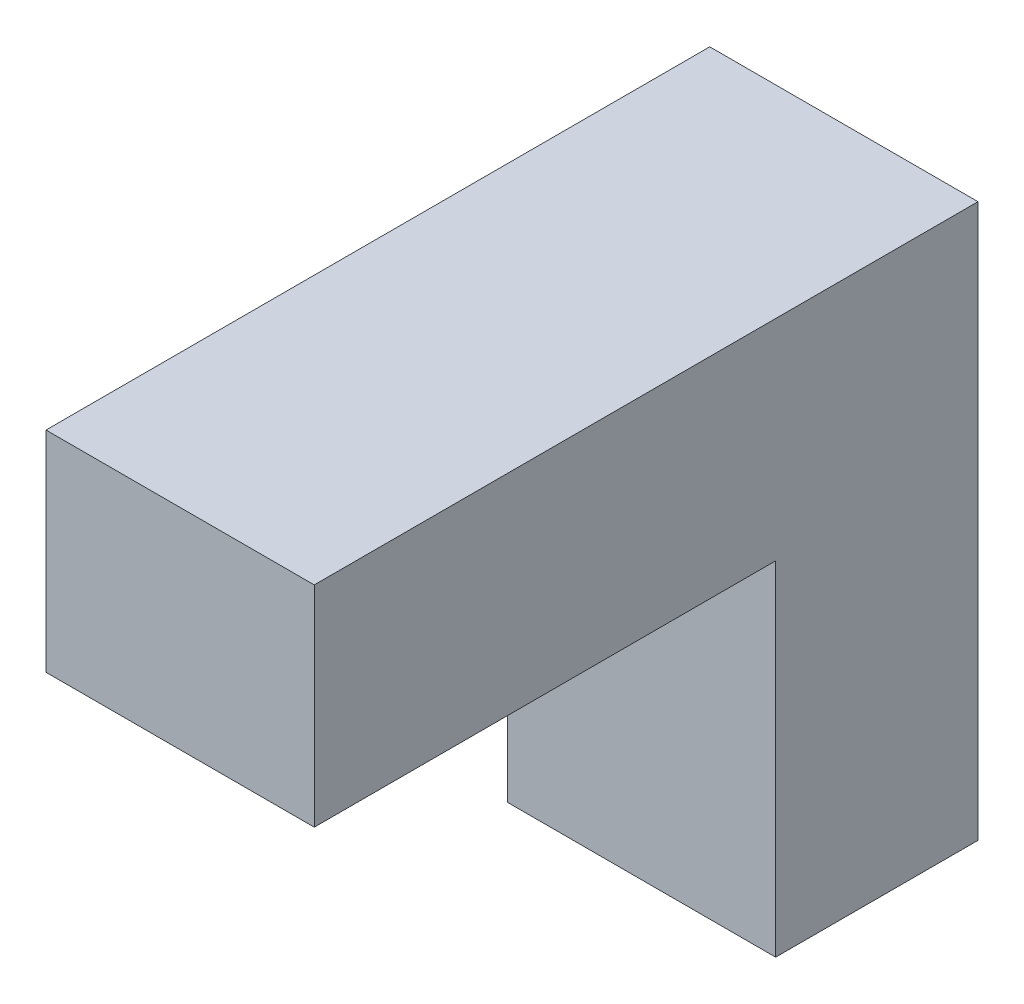
ISO-10303-21;
HEADER;
FILE_DESCRIPTION(('STEP AP214'),'2;1');
FILE_NAME('part.step','',(''),(''),'','','');
FILE_SCHEMA(('AUTOMOTIVE_DESIGN { 1 0 10303 214 1 1 1 1 }'));
ENDSEC;
DATA;
#1=APPLICATION_CONTEXT('core data for automotive mechanical design processes');
#2=APPLICATION_PROTOCOL_DEFINITION('international standard','automotive_design',2000,#1);
#3=PRODUCT_CONTEXT('',#1,'mechanical');
#4=PRODUCT('Part','Part','',(#3));
#5=PRODUCT_RELATED_PRODUCT_CATEGORY('part','',(#4));
#6=PRODUCT_DEFINITION_FORMATION('','',#4);
#7=PRODUCT_DEFINITION_CONTEXT('part definition',#1,'design');
#8=PRODUCT_DEFINITION('design','',#6,#7);
#9=PRODUCT_DEFINITION_SHAPE('','',#8);
#10=(LENGTH_UNIT() NAMED_UNIT(*) SI_UNIT(.MILLI.,.METRE.));
#11=(NAMED_UNIT(*) PLANE_ANGLE_UNIT() SI_UNIT($,.RADIAN.));
#12=(NAMED_UNIT(*) SI_UNIT($,.STERADIAN.) SOLID_ANGLE_UNIT());
#13=UNCERTAINTY_MEASURE_WITH_UNIT(LENGTH_MEASURE(1.E-05),#10,'distance_accuracy_value','');
#14=(GEOMETRIC_REPRESENTATION_CONTEXT(3) GLOBAL_UNCERTAINTY_ASSIGNED_CONTEXT((#13)) GLOBAL_UNIT_ASSIGNED_CONTEXT((#10,
#11,#12)) REPRESENTATION_CONTEXT('',''));
#15=CARTESIAN_POINT('',(0.,0.,0.));
#16=DIRECTION('',(0.,0.,1.));
#17=DIRECTION('',(1.,0.,0.));
#18=AXIS2_PLACEMENT_3D('',#15,#16,#17);
#19=CARTESIAN_POINT('',(9.7,0.,7.31641940323385));
#20=DIRECTION('',(0.,1.,0.));
#21=DIRECTION('',(0.,0.,1.));
#22=AXIS2_PLACEMENT_3D('',#19,#20,#21);
#23=PLANE('',#22);
#24=DIRECTION('',(0.,0.,-1.));
#25=VECTOR('',#24,1.);
#26=CARTESIAN_POINT('',(1.,0.,6.31641940323385));
#27=LINE('',#26,#25);
#28=CARTESIAN_POINT('',(0.999999999999999,0.,6.31641940323385));
#29=VERTEX_POINT('',#28);
#30=CARTESIAN_POINT('',(1.,0.,1.));
#31=VERTEX_POINT('',#30);
#32=EDGE_CURVE('E211',#29,#31,#27,.T.);
#33=ORIENTED_EDGE('',*,*,#32,.F.);
#34=DIRECTION('',(-1.,0.,0.));
#35=VECTOR('',#34,1.);
#36=CARTESIAN_POINT('',(8.7,0.,6.31641940323385));
#37=LINE('',#36,#35);
#38=CARTESIAN_POINT('',(8.7,0.,6.31641940323385));
#39=VERTEX_POINT('',#38);
#40=EDGE_CURVE('E56',#39,#29,#37,.T.);
#41=ORIENTED_EDGE('',*,*,#40,.F.);
#42=DIRECTION('',(0.,0.,1.));
#43=VECTOR('',#42,1.);
#44=CARTESIAN_POINT('',(8.7,0.,1.));
#45=LINE('',#44,#43);
#46=CARTESIAN_POINT('',(8.7,0.,1.));
#47=VERTEX_POINT('',#46);
#48=EDGE_CURVE('E192',#47,#39,#45,.T.);
#49=ORIENTED_EDGE('',*,*,#48,.F.);
#50=DIRECTION('',(1.,0.,0.));
#51=VECTOR('',#50,1.);
#52=CARTESIAN_POINT('',(1.,0.,1.));
#53=LINE('',#52,#51);
#54=EDGE_CURVE('E207',#31,#47,#53,.T.);
#55=ORIENTED_EDGE('',*,*,#54,.F.);
#56=EDGE_LOOP('',(#33,#41,#49,#55));
#57=FACE_BOUND('',#56,.T.);
#58=DIRECTION('',(0.,0.,-1.));
#59=VECTOR('',#58,1.);
#60=CARTESIAN_POINT('',(0.,0.,7.31641940323385));
#61=LINE('',#60,#59);
#62=CARTESIAN_POINT('',(0.,0.,7.31641940323385));
#63=VERTEX_POINT('',#62);
#64=CARTESIAN_POINT('',(0.,0.,0.));
#65=VERTEX_POINT('',#64);
#66=EDGE_CURVE('E142',#63,#65,#61,.T.);
#67=ORIENTED_EDGE('',*,*,#66,.T.);
#68=DIRECTION('',(-1.,0.,0.));
#69=VECTOR('',#68,1.);
#70=CARTESIAN_POINT('',(9.7,0.,0.));
#71=LINE('',#70,#69);
#72=CARTESIAN_POINT('',(9.7,0.,0.));
#73=VERTEX_POINT('',#72);
#74=EDGE_CURVE('E12',#73,#65,#71,.T.);
#75=ORIENTED_EDGE('',*,*,#74,.F.);
#76=DIRECTION('',(0.,0.,-1.));
#77=VECTOR('',#76,1.);
#78=CARTESIAN_POINT('',(9.7,0.,7.31641940323385));
#79=LINE('',#78,#77);
#80=CARTESIAN_POINT('',(9.7,0.,7.31641940323385));
#81=VERTEX_POINT('',#80);
#82=EDGE_CURVE('E160',#81,#73,#79,.T.);
#83=ORIENTED_EDGE('',*,*,#82,.F.);
#84=DIRECTION('',(-1.,0.,0.));
#85=VECTOR('',#84,1.);
#86=CARTESIAN_POINT('',(9.7,0.,7.31641940323385));
#87=LINE('',#86,#85);
#88=EDGE_CURVE('E138',#81,#63,#87,.T.);
#89=ORIENTED_EDGE('',*,*,#88,.T.);
#90=EDGE_LOOP('',(#67,#75,#83,#89));
#91=FACE_BOUND('',#90,.T.);
#92=ADVANCED_FACE('F41',(#57,#91),#23,.F.);
#93=CARTESIAN_POINT('',(9.7,0.,0.));
#94=DIRECTION('',(0.,0.,1.));
#95=DIRECTION('',(1.,0.,0.));
#96=AXIS2_PLACEMENT_3D('',#93,#94,#95);
#97=PLANE('',#96);
#98=DIRECTION('',(0.,1.,0.));
#99=VECTOR('',#98,1.);
#100=CARTESIAN_POINT('',(0.,0.,0.));
#101=LINE('',#100,#99);
#102=CARTESIAN_POINT('',(0.,20.,0.));
#103=VERTEX_POINT('',#102);
#104=EDGE_CURVE('E146',#65,#103,#101,.T.);
#105=ORIENTED_EDGE('',*,*,#104,.T.);
#106=DIRECTION('',(-1.,0.,0.));
#107=VECTOR('',#106,1.);
#108=CARTESIAN_POINT('',(9.7,20.,0.));
#109=LINE('',#108,#107);
#110=CARTESIAN_POINT('',(9.7,20.,0.));
#111=VERTEX_POINT('',#110);
#112=EDGE_CURVE('E49',#111,#103,#109,.T.);
#113=ORIENTED_EDGE('',*,*,#112,.F.);
#114=DIRECTION('',(0.,1.,0.));
#115=VECTOR('',#114,1.);
#116=CARTESIAN_POINT('',(9.7,0.,0.));
#117=LINE('',#116,#115);
#118=EDGE_CURVE('E100',#73,#111,#117,.T.);
#119=ORIENTED_EDGE('',*,*,#118,.F.);
#120=ORIENTED_EDGE('',*,*,#74,.T.);
#121=EDGE_LOOP('',(#105,#113,#119,#120));
#122=FACE_BOUND('',#121,.T.);
#123=ADVANCED_FACE('F266',(#122),#97,.F.);
#124=CARTESIAN_POINT('',(9.7,20.,0.));
#125=DIRECTION('',(0.,-1.,0.));
#126=DIRECTION('',(0.,0.,-1.));
#127=AXIS2_PLACEMENT_3D('',#124,#125,#126);
#128=PLANE('',#127);
#129=DIRECTION('',(0.,0.,1.));
#130=VECTOR('',#129,1.);
#131=CARTESIAN_POINT('',(0.,20.,0.));
#132=LINE('',#131,#130);
#133=CARTESIAN_POINT('',(0.,20.,24.));
#134=VERTEX_POINT('',#133);
#135=EDGE_CURVE('E150',#103,#134,#132,.T.);
#136=ORIENTED_EDGE('',*,*,#135,.T.);
#137=DIRECTION('',(-1.,0.,0.));
#138=VECTOR('',#137,1.);
#139=CARTESIAN_POINT('',(9.7,20.,24.));
#140=LINE('',#139,#138);
#141=CARTESIAN_POINT('',(9.7,20.,24.));
#142=VERTEX_POINT('',#141);
#143=EDGE_CURVE('E131',#142,#134,#140,.T.);
#144=ORIENTED_EDGE('',*,*,#143,.F.);
#145=DIRECTION('',(0.,0.,1.));
#146=VECTOR('',#145,1.);
#147=CARTESIAN_POINT('',(9.7,20.,0.));
#148=LINE('',#147,#146);
#149=EDGE_CURVE('E117',#111,#142,#148,.T.);
#150=ORIENTED_EDGE('',*,*,#149,.F.);
#151=ORIENTED_EDGE('',*,*,#112,.T.);
#152=EDGE_LOOP('',(#136,#144,#150,#151));
#153=FACE_BOUND('',#152,.T.);
#154=ADVANCED_FACE('F170',(#153),#128,.F.);
#155=CARTESIAN_POINT('',(9.7,20.,24.));
#156=DIRECTION('',(0.,0.,-1.));
#157=DIRECTION('',(-1.,0.,0.));
#158=AXIS2_PLACEMENT_3D('',#155,#156,#157);
#159=PLANE('',#158);
#160=DIRECTION('',(0.,-1.,0.));
#161=VECTOR('',#160,1.);
#162=CARTESIAN_POINT('',(0.,20.,24.));
#163=LINE('',#162,#161);
#164=CARTESIAN_POINT('',(0.,12.41260210035,24.));
#165=VERTEX_POINT('',#164);
#166=EDGE_CURVE('E127',#134,#165,#163,.T.);
#167=ORIENTED_EDGE('',*,*,#166,.T.);
#168=DIRECTION('',(-1.,0.,0.));
#169=VECTOR('',#168,1.);
#170=CARTESIAN_POINT('',(9.7,12.41260210035,24.));
#171=LINE('',#170,#169);
#172=CARTESIAN_POINT('',(9.7,12.41260210035,24.));
#173=VERTEX_POINT('',#172);
#174=EDGE_CURVE('E124',#173,#165,#171,.T.);
#175=ORIENTED_EDGE('',*,*,#174,.F.);
#176=DIRECTION('',(0.,-1.,0.));
#177=VECTOR('',#176,1.);
#178=CARTESIAN_POINT('',(9.7,20.,24.));
#179=LINE('',#178,#177);
#180=EDGE_CURVE('E110',#142,#173,#179,.T.);
#181=ORIENTED_EDGE('',*,*,#180,.F.);
#182=ORIENTED_EDGE('',*,*,#143,.T.);
#183=EDGE_LOOP('',(#167,#175,#181,#182));
#184=FACE_BOUND('',#183,.T.);
#185=ADVANCED_FACE('F125',(#184),#159,.F.);
#186=CARTESIAN_POINT('',(9.7,12.41260210035,24.));
#187=DIRECTION('',(0.,1.,0.));
#188=DIRECTION('',(0.,0.,1.));
#189=AXIS2_PLACEMENT_3D('',#186,#187,#188);
#190=PLANE('',#189);
#191=DIRECTION('',(0.,0.,-1.));
#192=VECTOR('',#191,1.);
#193=CARTESIAN_POINT('',(0.,12.41260210035,24.));
#194=LINE('',#193,#192);
#195=CARTESIAN_POINT('',(0.,12.41260210035,7.31641940323386));
#196=VERTEX_POINT('',#195);
#197=EDGE_CURVE('E155',#165,#196,#194,.T.);
#198=ORIENTED_EDGE('',*,*,#197,.T.);
#199=DIRECTION('',(-1.,0.,0.));
#200=VECTOR('',#199,1.);
#201=CARTESIAN_POINT('',(9.7,12.41260210035,7.31641940323386));
#202=LINE('',#201,#200);
#203=CARTESIAN_POINT('',(9.7,12.41260210035,7.31641940323386));
#204=VERTEX_POINT('',#203);
#205=EDGE_CURVE('E132',#204,#196,#202,.T.);
#206=ORIENTED_EDGE('',*,*,#205,.F.);
#207=DIRECTION('',(0.,0.,-1.));
#208=VECTOR('',#207,1.);
#209=CARTESIAN_POINT('',(9.7,12.41260210035,24.));
#210=LINE('',#209,#208);
#211=EDGE_CURVE('E114',#173,#204,#210,.T.);
#212=ORIENTED_EDGE('',*,*,#211,.F.);
#213=ORIENTED_EDGE('',*,*,#174,.T.);
#214=EDGE_LOOP('',(#198,#206,#212,#213));
#215=FACE_BOUND('',#214,.T.);
#216=ADVANCED_FACE('F134',(#215),#190,.F.);
#217=CARTESIAN_POINT('',(9.7,12.41260210035,7.31641940323386));
#218=DIRECTION('',(0.,0.,-1.));
#219=DIRECTION('',(0.,1.,0.));
#220=AXIS2_PLACEMENT_3D('',#217,#218,#219);
#221=PLANE('',#220);
#222=DIRECTION('',(0.,-1.,0.));
#223=VECTOR('',#222,1.);
#224=CARTESIAN_POINT('',(0.,12.41260210035,7.31641940323386));
#225=LINE('',#224,#223);
#226=EDGE_CURVE('E92',#196,#63,#225,.T.);
#227=ORIENTED_EDGE('',*,*,#226,.T.);
#228=ORIENTED_EDGE('',*,*,#88,.F.);
#229=DIRECTION('',(0.,-1.,0.));
#230=VECTOR('',#229,1.);
#231=CARTESIAN_POINT('',(9.7,12.41260210035,7.31641940323386));
#232=LINE('',#231,#230);
#233=EDGE_CURVE('E65',#204,#81,#232,.T.);
#234=ORIENTED_EDGE('',*,*,#233,.F.);
#235=ORIENTED_EDGE('',*,*,#205,.T.);
#236=EDGE_LOOP('',(#227,#228,#234,#235));
#237=FACE_BOUND('',#236,.T.);
#238=ADVANCED_FACE('F174',(#237),#221,.F.);
#239=CARTESIAN_POINT('',(9.7,0.,0.));
#240=DIRECTION('',(1.,0.,0.));
#241=DIRECTION('',(0.,0.,-1.));
#242=AXIS2_PLACEMENT_3D('',#239,#240,#241);
#243=PLANE('',#242);
#244=ORIENTED_EDGE('',*,*,#82,.T.);
#245=ORIENTED_EDGE('',*,*,#118,.T.);
#246=ORIENTED_EDGE('',*,*,#149,.T.);
#247=ORIENTED_EDGE('',*,*,#180,.T.);
#248=ORIENTED_EDGE('',*,*,#211,.T.);
#249=ORIENTED_EDGE('',*,*,#233,.T.);
#250=EDGE_LOOP('',(#244,#245,#246,#247,#248,#249));
#251=FACE_BOUND('',#250,.T.);
#252=ADVANCED_FACE('F112',(#251),#243,.T.);
#253=CARTESIAN_POINT('',(0.,0.,0.));
#254=DIRECTION('',(1.,0.,0.));
#255=DIRECTION('',(0.,0.,-1.));
#256=AXIS2_PLACEMENT_3D('',#253,#254,#255);
#257=PLANE('',#256);
#258=ORIENTED_EDGE('',*,*,#66,.F.);
#259=ORIENTED_EDGE('',*,*,#226,.F.);
#260=ORIENTED_EDGE('',*,*,#197,.F.);
#261=ORIENTED_EDGE('',*,*,#166,.F.);
#262=ORIENTED_EDGE('',*,*,#135,.F.);
#263=ORIENTED_EDGE('',*,*,#104,.F.);
#264=EDGE_LOOP('',(#258,#259,#260,#261,#262,#263));
#265=FACE_BOUND('',#264,.T.);
#266=ADVANCED_FACE('F173',(#265),#257,.F.);
#267=CARTESIAN_POINT('',(8.7,29.3570462898866,6.31641940323385));
#268=DIRECTION('',(0.,0.,1.));
#269=DIRECTION('',(1.,0.,0.));
#270=AXIS2_PLACEMENT_3D('',#267,#268,#269);
#271=PLANE('',#270);
#272=DIRECTION('',(1.,0.,0.));
#273=VECTOR('',#272,1.);
#274=CARTESIAN_POINT('',(8.7,17.,6.31641940323385));
#275=LINE('',#274,#273);
#276=CARTESIAN_POINT('',(1.,17.,6.31641940323385));
#277=VERTEX_POINT('',#276);
#278=CARTESIAN_POINT('',(8.7,17.,6.31641940323385));
#279=VERTEX_POINT('',#278);
#280=EDGE_CURVE('E187',#277,#279,#275,.T.);
#281=ORIENTED_EDGE('',*,*,#280,.T.);
#282=DIRECTION('',(0.,-1.,0.));
#283=VECTOR('',#282,1.);
#284=CARTESIAN_POINT('',(8.7,29.3570462898866,6.31641940323385));
#285=LINE('',#284,#283);
#286=EDGE_CURVE('E200',#279,#39,#285,.T.);
#287=ORIENTED_EDGE('',*,*,#286,.T.);
#288=ORIENTED_EDGE('',*,*,#40,.T.);
#289=DIRECTION('',(0.,-1.,0.));
#290=VECTOR('',#289,1.);
#291=CARTESIAN_POINT('',(1.,29.3570462898866,6.31641940323385));
#292=LINE('',#291,#290);
#293=EDGE_CURVE('E188',#277,#29,#292,.T.);
#294=ORIENTED_EDGE('',*,*,#293,.F.);
#295=EDGE_LOOP('',(#281,#287,#288,#294));
#296=FACE_BOUND('',#295,.T.);
#297=ADVANCED_FACE('F247',(#296),#271,.F.);
#298=CARTESIAN_POINT('',(8.7,29.3570462898866,1.));
#299=DIRECTION('',(1.,0.,0.));
#300=DIRECTION('',(0.,0.,-1.));
#301=AXIS2_PLACEMENT_3D('',#298,#299,#300);
#302=PLANE('',#301);
#303=DIRECTION('',(0.,0.,-1.));
#304=VECTOR('',#303,1.);
#305=CARTESIAN_POINT('',(8.7,17.,0.999999999999998));
#306=LINE('',#305,#304);
#307=CARTESIAN_POINT('',(8.7,17.,1.));
#308=VERTEX_POINT('',#307);
#309=EDGE_CURVE('E220',#279,#308,#306,.T.);
#310=ORIENTED_EDGE('',*,*,#309,.T.);
#311=DIRECTION('',(0.,-1.,0.));
#312=VECTOR('',#311,1.);
#313=CARTESIAN_POINT('',(8.7,29.3570462898866,1.));
#314=LINE('',#313,#312);
#315=EDGE_CURVE('E196',#308,#47,#314,.T.);
#316=ORIENTED_EDGE('',*,*,#315,.T.);
#317=ORIENTED_EDGE('',*,*,#48,.T.);
#318=ORIENTED_EDGE('',*,*,#286,.F.);
#319=EDGE_LOOP('',(#310,#316,#317,#318));
#320=FACE_BOUND('',#319,.T.);
#321=ADVANCED_FACE('F255',(#320),#302,.F.);
#322=CARTESIAN_POINT('',(1.,29.3570462898866,1.));
#323=DIRECTION('',(0.,0.,-1.));
#324=DIRECTION('',(-1.,0.,0.));
#325=AXIS2_PLACEMENT_3D('',#322,#323,#324);
#326=PLANE('',#325);
#327=DIRECTION('',(-1.,0.,0.));
#328=VECTOR('',#327,1.);
#329=CARTESIAN_POINT('',(1.,17.,1.));
#330=LINE('',#329,#328);
#331=CARTESIAN_POINT('',(1.,17.,1.));
#332=VERTEX_POINT('',#331);
#333=EDGE_CURVE('E203',#308,#332,#330,.T.);
#334=ORIENTED_EDGE('',*,*,#333,.T.);
#335=DIRECTION('',(0.,-1.,0.));
#336=VECTOR('',#335,1.);
#337=CARTESIAN_POINT('',(1.,29.3570462898866,1.));
#338=LINE('',#337,#336);
#339=EDGE_CURVE('E191',#332,#31,#338,.T.);
#340=ORIENTED_EDGE('',*,*,#339,.T.);
#341=ORIENTED_EDGE('',*,*,#54,.T.);
#342=ORIENTED_EDGE('',*,*,#315,.F.);
#343=EDGE_LOOP('',(#334,#340,#341,#342));
#344=FACE_BOUND('',#343,.T.);
#345=ADVANCED_FACE('F231',(#344),#326,.F.);
#346=CARTESIAN_POINT('',(1.,29.3570462898866,6.31641940323385));
#347=DIRECTION('',(-1.,0.,0.));
#348=DIRECTION('',(0.,0.,1.));
#349=AXIS2_PLACEMENT_3D('',#346,#347,#348);
#350=PLANE('',#349);
#351=DIRECTION('',(0.,0.,1.));
#352=VECTOR('',#351,1.);
#353=CARTESIAN_POINT('',(1.,17.,6.31641940323385));
#354=LINE('',#353,#352);
#355=EDGE_CURVE('E147',#332,#277,#354,.T.);
#356=ORIENTED_EDGE('',*,*,#355,.T.);
#357=ORIENTED_EDGE('',*,*,#293,.T.);
#358=ORIENTED_EDGE('',*,*,#32,.T.);
#359=ORIENTED_EDGE('',*,*,#339,.F.);
#360=EDGE_LOOP('',(#356,#357,#358,#359));
#361=FACE_BOUND('',#360,.T.);
#362=ADVANCED_FACE('F240',(#361),#350,.F.);
#363=CARTESIAN_POINT('',(9.7,17.,0.));
#364=DIRECTION('',(0.,-1.,0.));
#365=DIRECTION('',(0.,0.,-1.));
#366=AXIS2_PLACEMENT_3D('',#363,#364,#365);
#367=PLANE('',#366);
#368=ORIENTED_EDGE('',*,*,#280,.F.);
#369=ORIENTED_EDGE('',*,*,#355,.F.);
#370=ORIENTED_EDGE('',*,*,#333,.F.);
#371=ORIENTED_EDGE('',*,*,#309,.F.);
#372=EDGE_LOOP('',(#368,#369,#370,#371));
#373=FACE_BOUND('',#372,.T.);
#374=ADVANCED_FACE('F244',(#373),#367,.T.);
#375=CLOSED_SHELL('',(#92,#123,#154,#185,#216,#238,#252,#266,#297,#321,#345,#362,#374));
#376=MANIFOLD_SOLID_BREP('B2',#375);
#377=ADVANCED_BREP_SHAPE_REPRESENTATION('',(#18,#376),#14);
#378=SHAPE_DEFINITION_REPRESENTATION(#9,#377);
ENDSEC;
END-ISO-10303-21;
